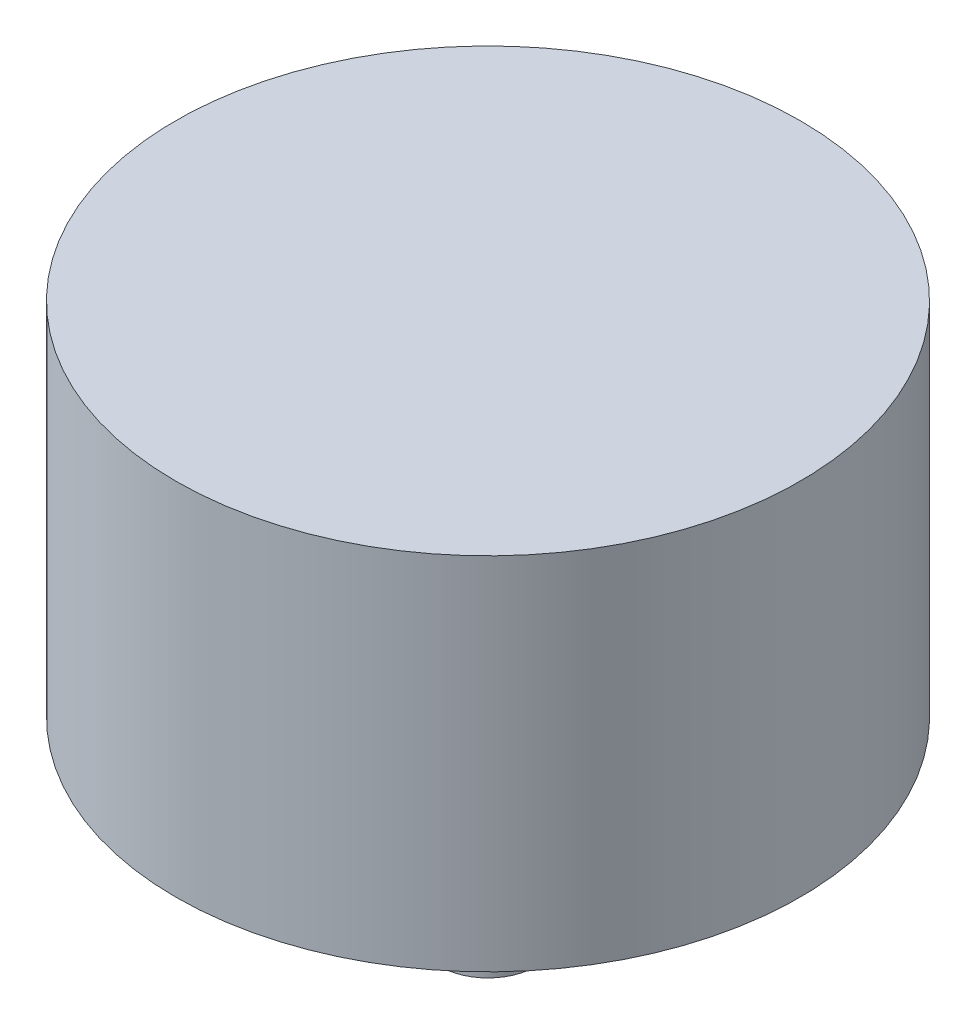
ISO-10303-21;
HEADER;
FILE_DESCRIPTION(('STEP AP214'),'2;1');
FILE_NAME('part.step','',(''),(''),'','','');
FILE_SCHEMA(('AUTOMOTIVE_DESIGN { 1 0 10303 214 1 1 1 1 }'));
ENDSEC;
DATA;
#1=APPLICATION_CONTEXT('core data for automotive mechanical design processes');
#2=APPLICATION_PROTOCOL_DEFINITION('international standard','automotive_design',2000,#1);
#3=PRODUCT_CONTEXT('',#1,'mechanical');
#4=PRODUCT('Part','Part','',(#3));
#5=PRODUCT_RELATED_PRODUCT_CATEGORY('part','',(#4));
#6=PRODUCT_DEFINITION_FORMATION('','',#4);
#7=PRODUCT_DEFINITION_CONTEXT('part definition',#1,'design');
#8=PRODUCT_DEFINITION('design','',#6,#7);
#9=PRODUCT_DEFINITION_SHAPE('','',#8);
#10=(LENGTH_UNIT() NAMED_UNIT(*) SI_UNIT(.MILLI.,.METRE.));
#11=(NAMED_UNIT(*) PLANE_ANGLE_UNIT() SI_UNIT($,.RADIAN.));
#12=(NAMED_UNIT(*) SI_UNIT($,.STERADIAN.) SOLID_ANGLE_UNIT());
#13=UNCERTAINTY_MEASURE_WITH_UNIT(LENGTH_MEASURE(1.E-05),#10,'distance_accuracy_value','');
#14=(GEOMETRIC_REPRESENTATION_CONTEXT(3) GLOBAL_UNCERTAINTY_ASSIGNED_CONTEXT((#13)) GLOBAL_UNIT_ASSIGNED_CONTEXT((#10,
#11,#12)) REPRESENTATION_CONTEXT('',''));
#15=CARTESIAN_POINT('',(0.,0.,0.));
#16=DIRECTION('',(0.,0.,1.));
#17=DIRECTION('',(1.,0.,0.));
#18=AXIS2_PLACEMENT_3D('',#15,#16,#17);
#19=CARTESIAN_POINT('',(0.,750.,0.));
#20=DIRECTION('',(0.,-1.,0.));
#21=DIRECTION('',(0.,0.,-1.));
#22=AXIS2_PLACEMENT_3D('',#19,#20,#21);
#23=CYLINDRICAL_SURFACE('',#22,650.);
#24=CARTESIAN_POINT('',(0.,750.,0.));
#25=DIRECTION('',(0.,1.,0.));
#26=DIRECTION('',(0.,0.,1.));
#27=AXIS2_PLACEMENT_3D('',#24,#25,#26);
#28=CIRCLE('',#27,650.);
#29=CARTESIAN_POINT('',(0.,750.,650.));
#30=VERTEX_POINT('',#29);
#31=EDGE_CURVE('E38',#30,#30,#28,.T.);
#32=ORIENTED_EDGE('',*,*,#31,.F.);
#33=EDGE_LOOP('',(#32));
#34=FACE_BOUND('',#33,.T.);
#35=CARTESIAN_POINT('',(0.,0.,0.));
#36=DIRECTION('',(0.,1.,0.));
#37=DIRECTION('',(0.,0.,1.));
#38=AXIS2_PLACEMENT_3D('',#35,#36,#37);
#39=CIRCLE('',#38,650.);
#40=CARTESIAN_POINT('',(0.,0.,650.));
#41=VERTEX_POINT('',#40);
#42=EDGE_CURVE('E34',#41,#41,#39,.T.);
#43=ORIENTED_EDGE('',*,*,#42,.T.);
#44=EDGE_LOOP('',(#43));
#45=FACE_BOUND('',#44,.T.);
#46=ADVANCED_FACE('F31',(#34,#45),#23,.T.);
#47=CARTESIAN_POINT('',(0.,750.,0.));
#48=DIRECTION('',(0.,1.,0.));
#49=DIRECTION('',(0.,0.,1.));
#50=AXIS2_PLACEMENT_3D('',#47,#48,#49);
#51=PLANE('',#50);
#52=ORIENTED_EDGE('',*,*,#31,.T.);
#53=EDGE_LOOP('',(#52));
#54=FACE_BOUND('',#53,.T.);
#55=ADVANCED_FACE('F55',(#54),#51,.T.);
#56=CARTESIAN_POINT('',(0.,0.,0.));
#57=DIRECTION('',(0.,1.,0.));
#58=DIRECTION('',(0.,0.,1.));
#59=AXIS2_PLACEMENT_3D('',#56,#57,#58);
#60=PLANE('',#59);
#61=CARTESIAN_POINT('',(0.,0.,0.));
#62=DIRECTION('',(0.,-1.,0.));
#63=DIRECTION('',(0.,0.,-1.));
#64=AXIS2_PLACEMENT_3D('',#61,#62,#63);
#65=CIRCLE('',#64,100.);
#66=CARTESIAN_POINT('',(0.,0.,-100.));
#67=VERTEX_POINT('',#66);
#68=EDGE_CURVE('E10',#67,#67,#65,.T.);
#69=ORIENTED_EDGE('',*,*,#68,.F.);
#70=EDGE_LOOP('',(#69));
#71=FACE_BOUND('',#70,.T.);
#72=ORIENTED_EDGE('',*,*,#42,.F.);
#73=EDGE_LOOP('',(#72));
#74=FACE_BOUND('',#73,.T.);
#75=ADVANCED_FACE('F52',(#71,#74),#60,.F.);
#76=CARTESIAN_POINT('',(0.,-400.,0.));
#77=DIRECTION('',(0.,1.,0.));
#78=DIRECTION('',(0.,0.,1.));
#79=AXIS2_PLACEMENT_3D('',#76,#77,#78);
#80=CYLINDRICAL_SURFACE('',#79,100.);
#81=CARTESIAN_POINT('',(0.,-400.,0.));
#82=DIRECTION('',(0.,-1.,0.));
#83=DIRECTION('',(0.,0.,-1.));
#84=AXIS2_PLACEMENT_3D('',#81,#82,#83);
#85=CIRCLE('',#84,100.);
#86=CARTESIAN_POINT('',(0.,-400.,-100.));
#87=VERTEX_POINT('',#86);
#88=EDGE_CURVE('E44',#87,#87,#85,.T.);
#89=ORIENTED_EDGE('',*,*,#88,.F.);
#90=EDGE_LOOP('',(#89));
#91=FACE_BOUND('',#90,.T.);
#92=ORIENTED_EDGE('',*,*,#68,.T.);
#93=EDGE_LOOP('',(#92));
#94=FACE_BOUND('',#93,.T.);
#95=ADVANCED_FACE('F54',(#91,#94),#80,.T.);
#96=CARTESIAN_POINT('',(0.,-400.,0.));
#97=DIRECTION('',(0.,-1.,0.));
#98=DIRECTION('',(0.,0.,-1.));
#99=AXIS2_PLACEMENT_3D('',#96,#97,#98);
#100=PLANE('',#99);
#101=ORIENTED_EDGE('',*,*,#88,.T.);
#102=EDGE_LOOP('',(#101));
#103=FACE_BOUND('',#102,.T.);
#104=ADVANCED_FACE('F61',(#103),#100,.T.);
#105=CLOSED_SHELL('',(#46,#55,#75,#95,#104));
#106=MANIFOLD_SOLID_BREP('B2',#105);
#107=ADVANCED_BREP_SHAPE_REPRESENTATION('',(#18,#106),#14);
#108=SHAPE_DEFINITION_REPRESENTATION(#9,#107);
ENDSEC;
END-ISO-10303-21;
